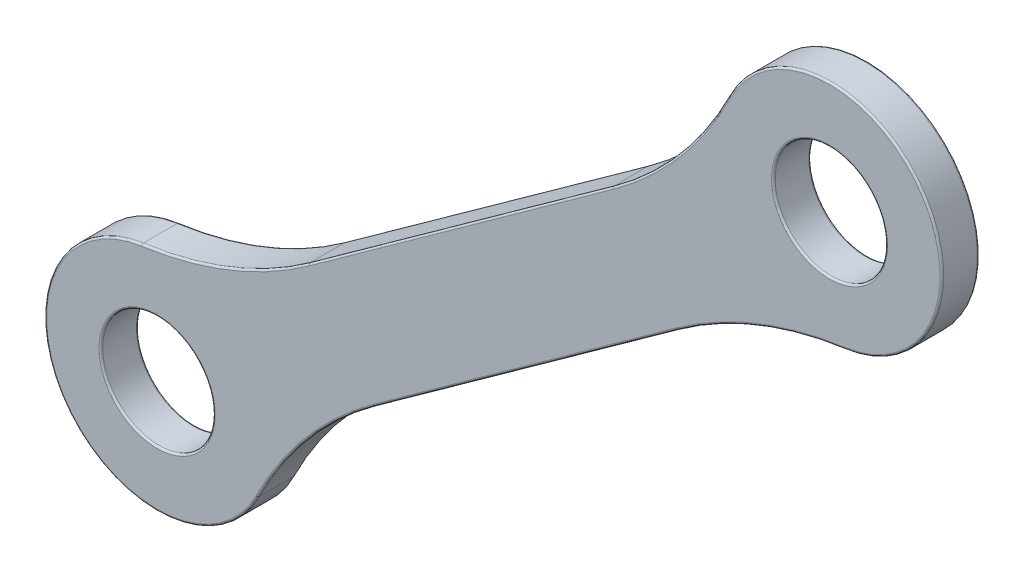
ISO-10303-21;
HEADER;
FILE_DESCRIPTION(('STEP AP214'),'2;1');
FILE_NAME('part.step','',(''),(''),'','','');
FILE_SCHEMA(('AUTOMOTIVE_DESIGN { 1 0 10303 214 1 1 1 1 }'));
ENDSEC;
DATA;
#1=APPLICATION_CONTEXT('core data for automotive mechanical design processes');
#2=APPLICATION_PROTOCOL_DEFINITION('international standard','automotive_design',2000,#1);
#3=PRODUCT_CONTEXT('',#1,'mechanical');
#4=PRODUCT('Part','Part','',(#3));
#5=PRODUCT_RELATED_PRODUCT_CATEGORY('part','',(#4));
#6=PRODUCT_DEFINITION_FORMATION('','',#4);
#7=PRODUCT_DEFINITION_CONTEXT('part definition',#1,'design');
#8=PRODUCT_DEFINITION('design','',#6,#7);
#9=PRODUCT_DEFINITION_SHAPE('','',#8);
#10=(LENGTH_UNIT() NAMED_UNIT(*) SI_UNIT(.MILLI.,.METRE.));
#11=(NAMED_UNIT(*) PLANE_ANGLE_UNIT() SI_UNIT($,.RADIAN.));
#12=(NAMED_UNIT(*) SI_UNIT($,.STERADIAN.) SOLID_ANGLE_UNIT());
#13=UNCERTAINTY_MEASURE_WITH_UNIT(LENGTH_MEASURE(1.E-05),#10,'distance_accuracy_value','');
#14=(GEOMETRIC_REPRESENTATION_CONTEXT(3) GLOBAL_UNCERTAINTY_ASSIGNED_CONTEXT((#13)) GLOBAL_UNIT_ASSIGNED_CONTEXT((#10,
#11,#12)) REPRESENTATION_CONTEXT('',''));
#15=CARTESIAN_POINT('',(0.,0.,0.));
#16=DIRECTION('',(0.,0.,1.));
#17=DIRECTION('',(1.,0.,0.));
#18=AXIS2_PLACEMENT_3D('',#15,#16,#17);
#19=CARTESIAN_POINT('',(-40.4013737131987,56.2481205256986,3.));
#20=DIRECTION('',(-0.583379304589784,0.812199844235604,0.));
#21=DIRECTION('',(-0.812199844235604,-0.583379304589784,0.));
#22=AXIS2_PLACEMENT_3D('',#19,#20,#21);
#23=PLANE('',#22);
#24=DIRECTION('',(0.,0.,-1.));
#25=VECTOR('',#24,1.);
#26=CARTESIAN_POINT('',(53.3787262530167,123.607613255152,3.));
#27=LINE('',#26,#25);
#28=CARTESIAN_POINT('',(53.3787262530167,123.607613255152,2.85));
#29=VERTEX_POINT('',#28);
#30=CARTESIAN_POINT('',(53.3787262530167,123.607613255152,0.15));
#31=VERTEX_POINT('',#30);
#32=EDGE_CURVE('E303',#29,#31,#27,.T.);
#33=ORIENTED_EDGE('',*,*,#32,.T.);
#34=DIRECTION('',(0.812199844235604,0.583379304589784,0.));
#35=VECTOR('',#34,1.);
#36=CARTESIAN_POINT('',(29.0765944172789,106.152105388458,0.15));
#37=LINE('',#36,#35);
#38=CARTESIAN_POINT('',(29.0765944172789,106.152105388458,0.15));
#39=VERTEX_POINT('',#38);
#40=EDGE_CURVE('E215',#31,#39,#37,.F.);
#41=ORIENTED_EDGE('',*,*,#40,.T.);
#42=DIRECTION('',(0.,0.,-1.));
#43=VECTOR('',#42,1.);
#44=CARTESIAN_POINT('',(29.0765944172789,106.152105388458,3.));
#45=LINE('',#44,#43);
#46=CARTESIAN_POINT('',(29.0765944172789,106.152105388458,2.85));
#47=VERTEX_POINT('',#46);
#48=EDGE_CURVE('E308',#39,#47,#45,.F.);
#49=ORIENTED_EDGE('',*,*,#48,.T.);
#50=DIRECTION('',(0.812199844235604,0.583379304589784,0.));
#51=VECTOR('',#50,1.);
#52=CARTESIAN_POINT('',(-40.4013737131987,56.2481205256986,2.85));
#53=LINE('',#52,#51);
#54=EDGE_CURVE('E213',#47,#29,#53,.T.);
#55=ORIENTED_EDGE('',*,*,#54,.T.);
#56=EDGE_LOOP('',(#33,#41,#49,#55));
#57=FACE_BOUND('',#56,.T.);
#58=ADVANCED_FACE('F35',(#57),#23,.T.);
#59=CARTESIAN_POINT('',(16.930701628719,91.8875588352438,3.));
#60=DIRECTION('',(0.,0.,-1.));
#61=DIRECTION('',(-1.,0.,0.));
#62=AXIS2_PLACEMENT_3D('',#59,#60,#61);
#63=CYLINDRICAL_SURFACE('',#62,9.00000000000006);
#64=DIRECTION('',(0.,0.,-1.));
#65=VECTOR('',#64,1.);
#66=CARTESIAN_POINT('',(15.6948201635343,100.802299269155,3.));
#67=LINE('',#66,#65);
#68=CARTESIAN_POINT('',(15.6948201635343,100.802299269155,2.85));
#69=VERTEX_POINT('',#68);
#70=CARTESIAN_POINT('',(15.6948201635343,100.802299269155,0.15));
#71=VERTEX_POINT('',#70);
#72=EDGE_CURVE('E301',#69,#71,#67,.T.);
#73=ORIENTED_EDGE('',*,*,#72,.T.);
#74=CARTESIAN_POINT('',(16.930701628719,91.8875588352438,0.15));
#75=DIRECTION('',(0.,0.,1.));
#76=DIRECTION('',(1.,0.,0.));
#77=AXIS2_PLACEMENT_3D('',#74,#75,#76);
#78=CIRCLE('',#77,9.00000000000006);
#79=CARTESIAN_POINT('',(24.9840137058486,87.8695786724804,0.15));
#80=VERTEX_POINT('',#79);
#81=EDGE_CURVE('E223',#71,#80,#78,.T.);
#82=ORIENTED_EDGE('',*,*,#81,.T.);
#83=DIRECTION('',(0.,0.,-1.));
#84=VECTOR('',#83,1.);
#85=CARTESIAN_POINT('',(24.9840137058486,87.8695786724804,3.));
#86=LINE('',#85,#84);
#87=CARTESIAN_POINT('',(24.9840137058486,87.8695786724804,2.85));
#88=VERTEX_POINT('',#87);
#89=EDGE_CURVE('E258',#80,#88,#86,.F.);
#90=ORIENTED_EDGE('',*,*,#89,.T.);
#91=CARTESIAN_POINT('',(16.930701628719,91.8875588352438,2.85));
#92=DIRECTION('',(0.,0.,1.));
#93=DIRECTION('',(1.,0.,0.));
#94=AXIS2_PLACEMENT_3D('',#91,#92,#93);
#95=CIRCLE('',#94,9.00000000000006);
#96=EDGE_CURVE('E221',#88,#69,#95,.F.);
#97=ORIENTED_EDGE('',*,*,#96,.T.);
#98=EDGE_LOOP('',(#73,#82,#90,#97));
#99=FACE_BOUND('',#98,.T.);
#100=ADVANCED_FACE('F299',(#99),#63,.T.);
#101=CARTESIAN_POINT('',(-35.1509599718906,48.9383219275781,3.));
#102=DIRECTION('',(-0.583379304589784,0.812199844235604,0.));
#103=DIRECTION('',(-0.812199844235604,-0.583379304589784,0.));
#104=AXIS2_PLACEMENT_3D('',#101,#102,#103);
#105=PLANE('',#104);
#106=DIRECTION('',(0.,0.,1.));
#107=VECTOR('',#106,1.);
#108=CARTESIAN_POINT('',(34.3270081585869,98.8423067903375,0.));
#109=LINE('',#108,#107);
#110=CARTESIAN_POINT('',(34.3270081585869,98.8423067903375,2.85));
#111=VERTEX_POINT('',#110);
#112=CARTESIAN_POINT('',(34.3270081585869,98.8423067903375,0.15));
#113=VERTEX_POINT('',#112);
#114=EDGE_CURVE('E296',#111,#113,#109,.F.);
#115=ORIENTED_EDGE('',*,*,#114,.T.);
#116=DIRECTION('',(0.812199844235604,0.583379304589784,0.));
#117=VECTOR('',#116,1.);
#118=CARTESIAN_POINT('',(-35.1509599718906,48.9383219275781,0.15));
#119=LINE('',#118,#117);
#120=CARTESIAN_POINT('',(58.6291399943248,116.297814657031,0.15));
#121=VERTEX_POINT('',#120);
#122=EDGE_CURVE('E198',#113,#121,#119,.T.);
#123=ORIENTED_EDGE('',*,*,#122,.T.);
#124=DIRECTION('',(0.,0.,1.));
#125=VECTOR('',#124,1.);
#126=CARTESIAN_POINT('',(58.6291399943248,116.297814657031,3.));
#127=LINE('',#126,#125);
#128=CARTESIAN_POINT('',(58.6291399943248,116.297814657031,2.85));
#129=VERTEX_POINT('',#128);
#130=EDGE_CURVE('E311',#121,#129,#127,.T.);
#131=ORIENTED_EDGE('',*,*,#130,.T.);
#132=DIRECTION('',(0.812199844235604,0.583379304589784,0.));
#133=VECTOR('',#132,1.);
#134=CARTESIAN_POINT('',(34.3270081585869,98.8423067903375,2.85));
#135=LINE('',#134,#133);
#136=EDGE_CURVE('E196',#129,#111,#135,.F.);
#137=ORIENTED_EDGE('',*,*,#136,.T.);
#138=EDGE_LOOP('',(#115,#123,#131,#137));
#139=FACE_BOUND('',#138,.T.);
#140=ADVANCED_FACE('F344',(#139),#105,.F.);
#141=CARTESIAN_POINT('',(70.7750327828846,130.562361210245,3.));
#142=DIRECTION('',(0.,0.,-1.));
#143=DIRECTION('',(-1.,0.,0.));
#144=AXIS2_PLACEMENT_3D('',#141,#142,#143);
#145=CYLINDRICAL_SURFACE('',#144,4.50000000000001);
#146=CARTESIAN_POINT('',(70.7750327828846,130.562361210245,0.15));
#147=DIRECTION('',(0.,0.,1.));
#148=DIRECTION('',(1.,0.,0.));
#149=AXIS2_PLACEMENT_3D('',#146,#147,#148);
#150=CIRCLE('',#149,4.50000000000001);
#151=CARTESIAN_POINT('',(75.2750327828846,130.562361210245,0.15));
#152=VERTEX_POINT('',#151);
#153=EDGE_CURVE('E190',#152,#152,#150,.F.);
#154=ORIENTED_EDGE('',*,*,#153,.T.);
#155=EDGE_LOOP('',(#154));
#156=FACE_BOUND('',#155,.T.);
#157=CARTESIAN_POINT('',(70.7750327828846,130.562361210245,2.85));
#158=DIRECTION('',(0.,0.,1.));
#159=DIRECTION('',(1.,0.,0.));
#160=AXIS2_PLACEMENT_3D('',#157,#158,#159);
#161=CIRCLE('',#160,4.50000000000001);
#162=CARTESIAN_POINT('',(75.2750327828846,130.562361210245,2.85));
#163=VERTEX_POINT('',#162);
#164=EDGE_CURVE('E187',#163,#163,#161,.T.);
#165=ORIENTED_EDGE('',*,*,#164,.T.);
#166=EDGE_LOOP('',(#165));
#167=FACE_BOUND('',#166,.T.);
#168=ADVANCED_FACE('F390',(#156,#167),#145,.F.);
#169=CARTESIAN_POINT('',(70.7750327828846,130.562361210245,3.));
#170=DIRECTION('',(0.,0.,-1.));
#171=DIRECTION('',(-1.,0.,0.));
#172=AXIS2_PLACEMENT_3D('',#169,#170,#171);
#173=CYLINDRICAL_SURFACE('',#172,9.00000000000004);
#174=DIRECTION('',(0.,0.,-1.));
#175=VECTOR('',#174,1.);
#176=CARTESIAN_POINT('',(72.0109142480693,121.647620776334,3.));
#177=LINE('',#176,#175);
#178=CARTESIAN_POINT('',(72.0109142480693,121.647620776334,2.85));
#179=VERTEX_POINT('',#178);
#180=CARTESIAN_POINT('',(72.0109142480693,121.647620776334,0.15));
#181=VERTEX_POINT('',#180);
#182=EDGE_CURVE('E318',#179,#181,#177,.T.);
#183=ORIENTED_EDGE('',*,*,#182,.T.);
#184=CARTESIAN_POINT('',(70.7750327828846,130.562361210245,0.15));
#185=DIRECTION('',(0.,0.,1.));
#186=DIRECTION('',(1.,0.,0.));
#187=AXIS2_PLACEMENT_3D('',#184,#185,#186);
#188=CIRCLE('',#187,9.00000000000004);
#189=CARTESIAN_POINT('',(62.721720705755,134.580341373009,0.15));
#190=VERTEX_POINT('',#189);
#191=EDGE_CURVE('E206',#181,#190,#188,.T.);
#192=ORIENTED_EDGE('',*,*,#191,.T.);
#193=DIRECTION('',(0.,0.,-1.));
#194=VECTOR('',#193,1.);
#195=CARTESIAN_POINT('',(62.721720705755,134.580341373009,3.));
#196=LINE('',#195,#194);
#197=CARTESIAN_POINT('',(62.721720705755,134.580341373009,2.85));
#198=VERTEX_POINT('',#197);
#199=EDGE_CURVE('E315',#190,#198,#196,.F.);
#200=ORIENTED_EDGE('',*,*,#199,.T.);
#201=CARTESIAN_POINT('',(70.7750327828846,130.562361210245,2.85));
#202=DIRECTION('',(0.,0.,1.));
#203=DIRECTION('',(1.,0.,0.));
#204=AXIS2_PLACEMENT_3D('',#201,#202,#203);
#205=CIRCLE('',#204,9.00000000000004);
#206=EDGE_CURVE('E204',#198,#179,#205,.F.);
#207=ORIENTED_EDGE('',*,*,#206,.T.);
#208=EDGE_LOOP('',(#183,#192,#200,#207));
#209=FACE_BOUND('',#208,.T.);
#210=ADVANCED_FACE('F387',(#209),#173,.T.);
#211=CARTESIAN_POINT('',(16.930701628719,91.8875588352438,3.));
#212=DIRECTION('',(0.,0.,-1.));
#213=DIRECTION('',(-1.,0.,0.));
#214=AXIS2_PLACEMENT_3D('',#211,#212,#213);
#215=CYLINDRICAL_SURFACE('',#214,4.50000000000001);
#216=CARTESIAN_POINT('',(16.930701628719,91.8875588352438,0.15));
#217=DIRECTION('',(0.,0.,1.));
#218=DIRECTION('',(1.,0.,0.));
#219=AXIS2_PLACEMENT_3D('',#216,#217,#218);
#220=CIRCLE('',#219,4.50000000000001);
#221=CARTESIAN_POINT('',(21.430701628719,91.8875588352438,0.15));
#222=VERTEX_POINT('',#221);
#223=EDGE_CURVE('E170',#222,#222,#220,.F.);
#224=ORIENTED_EDGE('',*,*,#223,.T.);
#225=EDGE_LOOP('',(#224));
#226=FACE_BOUND('',#225,.T.);
#227=CARTESIAN_POINT('',(16.930701628719,91.8875588352438,2.85));
#228=DIRECTION('',(0.,0.,1.));
#229=DIRECTION('',(1.,0.,0.));
#230=AXIS2_PLACEMENT_3D('',#227,#228,#229);
#231=CIRCLE('',#230,4.50000000000001);
#232=CARTESIAN_POINT('',(21.430701628719,91.8875588352438,2.85));
#233=VERTEX_POINT('',#232);
#234=EDGE_CURVE('E321',#233,#233,#231,.T.);
#235=ORIENTED_EDGE('',*,*,#234,.T.);
#236=EDGE_LOOP('',(#235));
#237=FACE_BOUND('',#236,.T.);
#238=ADVANCED_FACE('F389',(#226,#237),#215,.F.);
#239=CARTESIAN_POINT('',(0.,0.,3.));
#240=DIRECTION('',(0.,0.,1.));
#241=DIRECTION('',(1.,0.,0.));
#242=AXIS2_PLACEMENT_3D('',#239,#240,#241);
#243=PLANE('',#242);
#244=CARTESIAN_POINT('',(16.930701628719,91.8875588352438,3.));
#245=DIRECTION('',(0.,0.,1.));
#246=DIRECTION('',(1.,0.,0.));
#247=AXIS2_PLACEMENT_3D('',#244,#245,#246);
#248=CIRCLE('',#247,4.65000000000001);
#249=CARTESIAN_POINT('',(21.580701628719,91.8875588352438,3.));
#250=VERTEX_POINT('',#249);
#251=EDGE_CURVE('E11',#250,#250,#248,.F.);
#252=ORIENTED_EDGE('',*,*,#251,.T.);
#253=EDGE_LOOP('',(#252));
#254=FACE_BOUND('',#253,.T.);
#255=CARTESIAN_POINT('',(70.7750327828846,130.562361210245,3.));
#256=DIRECTION('',(0.,0.,1.));
#257=DIRECTION('',(1.,0.,0.));
#258=AXIS2_PLACEMENT_3D('',#255,#256,#257);
#259=CIRCLE('',#258,4.65000000000001);
#260=CARTESIAN_POINT('',(75.4250327828846,130.562361210245,3.));
#261=VERTEX_POINT('',#260);
#262=EDGE_CURVE('E44',#261,#261,#259,.F.);
#263=ORIENTED_EDGE('',*,*,#262,.T.);
#264=EDGE_LOOP('',(#263));
#265=FACE_BOUND('',#264,.T.);
#266=CARTESIAN_POINT('',(70.7750327828846,130.562361210245,3.));
#267=DIRECTION('',(0.,0.,1.));
#268=DIRECTION('',(1.,0.,0.));
#269=AXIS2_PLACEMENT_3D('',#266,#267,#268);
#270=CIRCLE('',#269,8.85000000000004);
#271=CARTESIAN_POINT('',(71.9903162236496,121.796199783566,3.));
#272=VERTEX_POINT('',#271);
#273=CARTESIAN_POINT('',(62.8559425737072,134.513375036963,3.));
#274=VERTEX_POINT('',#273);
#275=EDGE_CURVE('E52',#272,#274,#270,.T.);
#276=ORIENTED_EDGE('',*,*,#275,.T.);
#277=CARTESIAN_POINT('',(35.8773471153232,147.97360858222,3.));
#278=DIRECTION('',(0.,0.,1.));
#279=DIRECTION('',(1.,0.,0.));
#280=AXIS2_PLACEMENT_3D('',#277,#278,#279);
#281=CIRCLE('',#280,30.15);
#282=CARTESIAN_POINT('',(53.4662331487052,123.485783278516,3.));
#283=VERTEX_POINT('',#282);
#284=EDGE_CURVE('E237',#274,#283,#281,.F.);
#285=ORIENTED_EDGE('',*,*,#284,.T.);
#286=DIRECTION('',(0.812199844235604,0.583379304589784,0.));
#287=VECTOR('',#286,1.);
#288=CARTESIAN_POINT('',(-40.3138668175102,56.1262905490632,3.));
#289=LINE('',#288,#287);
#290=CARTESIAN_POINT('',(29.1641013129673,106.030275411823,3.));
#291=VERTEX_POINT('',#290);
#292=EDGE_CURVE('E225',#283,#291,#289,.F.);
#293=ORIENTED_EDGE('',*,*,#292,.T.);
#294=CARTESIAN_POINT('',(11.5752152795854,130.518100715526,3.));
#295=DIRECTION('',(0.,0.,1.));
#296=DIRECTION('',(1.,0.,0.));
#297=AXIS2_PLACEMENT_3D('',#294,#295,#296);
#298=CIRCLE('',#297,30.15);
#299=CARTESIAN_POINT('',(15.7154181879541,100.653720261923,3.));
#300=VERTEX_POINT('',#299);
#301=EDGE_CURVE('E227',#291,#300,#298,.F.);
#302=ORIENTED_EDGE('',*,*,#301,.T.);
#303=CARTESIAN_POINT('',(16.930701628719,91.8875588352438,3.));
#304=DIRECTION('',(0.,0.,1.));
#305=DIRECTION('',(1.,0.,0.));
#306=AXIS2_PLACEMENT_3D('',#303,#304,#305);
#307=CIRCLE('',#306,8.85000000000006);
#308=CARTESIAN_POINT('',(24.8497918378965,87.9365450085265,3.));
#309=VERTEX_POINT('',#308);
#310=EDGE_CURVE('E229',#300,#309,#307,.T.);
#311=ORIENTED_EDGE('',*,*,#310,.T.);
#312=CARTESIAN_POINT('',(51.8283872962804,74.4763114632694,3.));
#313=DIRECTION('',(0.,0.,1.));
#314=DIRECTION('',(1.,0.,0.));
#315=AXIS2_PLACEMENT_3D('',#312,#313,#314);
#316=CIRCLE('',#315,30.15);
#317=CARTESIAN_POINT('',(34.2395012628984,98.9641367669729,3.));
#318=VERTEX_POINT('',#317);
#319=EDGE_CURVE('E231',#309,#318,#316,.F.);
#320=ORIENTED_EDGE('',*,*,#319,.T.);
#321=DIRECTION('',(0.812199844235604,0.583379304589784,0.));
#322=VECTOR('',#321,1.);
#323=CARTESIAN_POINT('',(58.5416330986364,116.419644633667,3.));
#324=LINE('',#323,#322);
#325=CARTESIAN_POINT('',(58.5416330986364,116.419644633667,3.));
#326=VERTEX_POINT('',#325);
#327=EDGE_CURVE('E233',#318,#326,#324,.T.);
#328=ORIENTED_EDGE('',*,*,#327,.T.);
#329=CARTESIAN_POINT('',(76.1305191320183,91.9318193299631,3.));
#330=DIRECTION('',(0.,0.,1.));
#331=DIRECTION('',(1.,0.,0.));
#332=AXIS2_PLACEMENT_3D('',#329,#330,#331);
#333=CIRCLE('',#332,30.15);
#334=EDGE_CURVE('E57',#326,#272,#333,.F.);
#335=ORIENTED_EDGE('',*,*,#334,.T.);
#336=EDGE_LOOP('',(#276,#285,#293,#302,#311,#320,#328,#335));
#337=FACE_BOUND('',#336,.T.);
#338=ADVANCED_FACE('F360',(#254,#265,#337),#243,.T.);
#339=CARTESIAN_POINT('',(0.,0.,0.));
#340=DIRECTION('',(0.,0.,1.));
#341=DIRECTION('',(1.,0.,0.));
#342=AXIS2_PLACEMENT_3D('',#339,#340,#341);
#343=PLANE('',#342);
#344=CARTESIAN_POINT('',(16.930701628719,91.8875588352438,0.));
#345=DIRECTION('',(0.,0.,1.));
#346=DIRECTION('',(1.,0.,0.));
#347=AXIS2_PLACEMENT_3D('',#344,#345,#346);
#348=CIRCLE('',#347,4.65000000000001);
#349=CARTESIAN_POINT('',(21.580701628719,91.8875588352438,0.));
#350=VERTEX_POINT('',#349);
#351=EDGE_CURVE('E179',#350,#350,#348,.T.);
#352=ORIENTED_EDGE('',*,*,#351,.T.);
#353=EDGE_LOOP('',(#352));
#354=FACE_BOUND('',#353,.T.);
#355=CARTESIAN_POINT('',(70.7750327828846,130.562361210245,0.));
#356=DIRECTION('',(0.,0.,1.));
#357=DIRECTION('',(1.,0.,0.));
#358=AXIS2_PLACEMENT_3D('',#355,#356,#357);
#359=CIRCLE('',#358,4.65000000000001);
#360=CARTESIAN_POINT('',(75.4250327828846,130.562361210245,0.));
#361=VERTEX_POINT('',#360);
#362=EDGE_CURVE('E176',#361,#361,#359,.T.);
#363=ORIENTED_EDGE('',*,*,#362,.T.);
#364=EDGE_LOOP('',(#363));
#365=FACE_BOUND('',#364,.T.);
#366=DIRECTION('',(0.812199844235604,0.583379304589784,0.));
#367=VECTOR('',#366,1.);
#368=CARTESIAN_POINT('',(-35.2384668675791,49.0601519042135,0.));
#369=LINE('',#368,#367);
#370=CARTESIAN_POINT('',(58.5416330986364,116.419644633667,0.));
#371=VERTEX_POINT('',#370);
#372=CARTESIAN_POINT('',(34.2395012628984,98.9641367669729,0.));
#373=VERTEX_POINT('',#372);
#374=EDGE_CURVE('E174',#371,#373,#369,.F.);
#375=ORIENTED_EDGE('',*,*,#374,.T.);
#376=CARTESIAN_POINT('',(51.8283872962804,74.4763114632694,0.));
#377=DIRECTION('',(0.,0.,1.));
#378=DIRECTION('',(1.,0.,0.));
#379=AXIS2_PLACEMENT_3D('',#376,#377,#378);
#380=CIRCLE('',#379,30.15);
#381=CARTESIAN_POINT('',(24.8497918378965,87.9365450085265,0.));
#382=VERTEX_POINT('',#381);
#383=EDGE_CURVE('E155',#373,#382,#380,.T.);
#384=ORIENTED_EDGE('',*,*,#383,.T.);
#385=CARTESIAN_POINT('',(16.930701628719,91.8875588352438,0.));
#386=DIRECTION('',(0.,0.,1.));
#387=DIRECTION('',(1.,0.,0.));
#388=AXIS2_PLACEMENT_3D('',#385,#386,#387);
#389=CIRCLE('',#388,8.85000000000006);
#390=CARTESIAN_POINT('',(15.7154181879541,100.653720261923,0.));
#391=VERTEX_POINT('',#390);
#392=EDGE_CURVE('E163',#382,#391,#389,.F.);
#393=ORIENTED_EDGE('',*,*,#392,.T.);
#394=CARTESIAN_POINT('',(11.5752152795854,130.518100715526,0.));
#395=DIRECTION('',(0.,0.,1.));
#396=DIRECTION('',(1.,0.,0.));
#397=AXIS2_PLACEMENT_3D('',#394,#395,#396);
#398=CIRCLE('',#397,30.15);
#399=CARTESIAN_POINT('',(29.1641013129673,106.030275411823,0.));
#400=VERTEX_POINT('',#399);
#401=EDGE_CURVE('E169',#391,#400,#398,.T.);
#402=ORIENTED_EDGE('',*,*,#401,.T.);
#403=DIRECTION('',(0.812199844235604,0.583379304589784,0.));
#404=VECTOR('',#403,1.);
#405=CARTESIAN_POINT('',(53.4662331487052,123.485783278516,0.));
#406=LINE('',#405,#404);
#407=CARTESIAN_POINT('',(53.4662331487052,123.485783278516,0.));
#408=VERTEX_POINT('',#407);
#409=EDGE_CURVE('E327',#400,#408,#406,.T.);
#410=ORIENTED_EDGE('',*,*,#409,.T.);
#411=CARTESIAN_POINT('',(35.8773471153232,147.97360858222,0.));
#412=DIRECTION('',(0.,0.,1.));
#413=DIRECTION('',(1.,0.,0.));
#414=AXIS2_PLACEMENT_3D('',#411,#412,#413);
#415=CIRCLE('',#414,30.15);
#416=CARTESIAN_POINT('',(62.8559425737072,134.513375036963,0.));
#417=VERTEX_POINT('',#416);
#418=EDGE_CURVE('E329',#408,#417,#415,.T.);
#419=ORIENTED_EDGE('',*,*,#418,.T.);
#420=CARTESIAN_POINT('',(70.7750327828846,130.562361210245,0.));
#421=DIRECTION('',(0.,0.,1.));
#422=DIRECTION('',(1.,0.,0.));
#423=AXIS2_PLACEMENT_3D('',#420,#421,#422);
#424=CIRCLE('',#423,8.85000000000004);
#425=CARTESIAN_POINT('',(71.9903162236496,121.796199783566,0.));
#426=VERTEX_POINT('',#425);
#427=EDGE_CURVE('E331',#417,#426,#424,.F.);
#428=ORIENTED_EDGE('',*,*,#427,.T.);
#429=CARTESIAN_POINT('',(76.1305191320183,91.9318193299631,0.));
#430=DIRECTION('',(0.,0.,1.));
#431=DIRECTION('',(1.,0.,0.));
#432=AXIS2_PLACEMENT_3D('',#429,#430,#431);
#433=CIRCLE('',#432,30.15);
#434=EDGE_CURVE('E181',#426,#371,#433,.T.);
#435=ORIENTED_EDGE('',*,*,#434,.T.);
#436=EDGE_LOOP('',(#375,#384,#393,#402,#410,#419,#428,#435));
#437=FACE_BOUND('',#436,.T.);
#438=ADVANCED_FACE('F172',(#354,#365,#437),#343,.F.);
#439=CARTESIAN_POINT('',(11.5752152795854,130.518100715526,3.));
#440=DIRECTION('',(0.,0.,-1.));
#441=DIRECTION('',(-1.,0.,0.));
#442=AXIS2_PLACEMENT_3D('',#439,#440,#441);
#443=CYLINDRICAL_SURFACE('',#442,30.);
#444=ORIENTED_EDGE('',*,*,#48,.F.);
#445=CARTESIAN_POINT('',(11.5752152795854,130.518100715526,0.15));
#446=DIRECTION('',(0.,0.,1.));
#447=DIRECTION('',(1.,0.,0.));
#448=AXIS2_PLACEMENT_3D('',#445,#446,#447);
#449=CIRCLE('',#448,30.);
#450=EDGE_CURVE('E219',#39,#71,#449,.F.);
#451=ORIENTED_EDGE('',*,*,#450,.T.);
#452=ORIENTED_EDGE('',*,*,#72,.F.);
#453=CARTESIAN_POINT('',(11.5752152795854,130.518100715526,2.85));
#454=DIRECTION('',(0.,0.,1.));
#455=DIRECTION('',(1.,0.,0.));
#456=AXIS2_PLACEMENT_3D('',#453,#454,#455);
#457=CIRCLE('',#456,30.);
#458=EDGE_CURVE('E217',#69,#47,#457,.T.);
#459=ORIENTED_EDGE('',*,*,#458,.T.);
#460=EDGE_LOOP('',(#444,#451,#452,#459));
#461=FACE_BOUND('',#460,.T.);
#462=ADVANCED_FACE('F408',(#461),#443,.F.);
#463=CARTESIAN_POINT('',(51.8283872962804,74.4763114632694,3.));
#464=DIRECTION('',(0.,0.,-1.));
#465=DIRECTION('',(-1.,0.,0.));
#466=AXIS2_PLACEMENT_3D('',#463,#464,#465);
#467=CYLINDRICAL_SURFACE('',#466,30.);
#468=ORIENTED_EDGE('',*,*,#89,.F.);
#469=CARTESIAN_POINT('',(51.8283872962804,74.4763114632694,0.15));
#470=DIRECTION('',(0.,0.,1.));
#471=DIRECTION('',(1.,0.,0.));
#472=AXIS2_PLACEMENT_3D('',#469,#470,#471);
#473=CIRCLE('',#472,30.);
#474=EDGE_CURVE('E157',#80,#113,#473,.F.);
#475=ORIENTED_EDGE('',*,*,#474,.T.);
#476=ORIENTED_EDGE('',*,*,#114,.F.);
#477=CARTESIAN_POINT('',(51.8283872962804,74.4763114632694,2.85));
#478=DIRECTION('',(0.,0.,1.));
#479=DIRECTION('',(1.,0.,0.));
#480=AXIS2_PLACEMENT_3D('',#477,#478,#479);
#481=CIRCLE('',#480,30.);
#482=EDGE_CURVE('E193',#111,#88,#481,.T.);
#483=ORIENTED_EDGE('',*,*,#482,.T.);
#484=EDGE_LOOP('',(#468,#475,#476,#483));
#485=FACE_BOUND('',#484,.T.);
#486=ADVANCED_FACE('F294',(#485),#467,.F.);
#487=CARTESIAN_POINT('',(76.1305191320183,91.9318193299631,3.));
#488=DIRECTION('',(0.,0.,-1.));
#489=DIRECTION('',(-1.,0.,0.));
#490=AXIS2_PLACEMENT_3D('',#487,#488,#489);
#491=CYLINDRICAL_SURFACE('',#490,30.);
#492=ORIENTED_EDGE('',*,*,#130,.F.);
#493=CARTESIAN_POINT('',(76.1305191320183,91.9318193299631,0.15));
#494=DIRECTION('',(0.,0.,1.));
#495=DIRECTION('',(1.,0.,0.));
#496=AXIS2_PLACEMENT_3D('',#493,#494,#495);
#497=CIRCLE('',#496,30.);
#498=EDGE_CURVE('E202',#121,#181,#497,.F.);
#499=ORIENTED_EDGE('',*,*,#498,.T.);
#500=ORIENTED_EDGE('',*,*,#182,.F.);
#501=CARTESIAN_POINT('',(76.1305191320183,91.9318193299631,2.85));
#502=DIRECTION('',(0.,0.,1.));
#503=DIRECTION('',(1.,0.,0.));
#504=AXIS2_PLACEMENT_3D('',#501,#502,#503);
#505=CIRCLE('',#504,30.);
#506=EDGE_CURVE('E200',#179,#129,#505,.T.);
#507=ORIENTED_EDGE('',*,*,#506,.T.);
#508=EDGE_LOOP('',(#492,#499,#500,#507));
#509=FACE_BOUND('',#508,.T.);
#510=ADVANCED_FACE('F346',(#509),#491,.F.);
#511=CARTESIAN_POINT('',(35.8773471153232,147.97360858222,3.));
#512=DIRECTION('',(0.,0.,-1.));
#513=DIRECTION('',(-1.,0.,0.));
#514=AXIS2_PLACEMENT_3D('',#511,#512,#513);
#515=CYLINDRICAL_SURFACE('',#514,30.);
#516=ORIENTED_EDGE('',*,*,#199,.F.);
#517=CARTESIAN_POINT('',(35.8773471153232,147.97360858222,0.15));
#518=DIRECTION('',(0.,0.,1.));
#519=DIRECTION('',(1.,0.,0.));
#520=AXIS2_PLACEMENT_3D('',#517,#518,#519);
#521=CIRCLE('',#520,30.);
#522=EDGE_CURVE('E211',#190,#31,#521,.F.);
#523=ORIENTED_EDGE('',*,*,#522,.T.);
#524=ORIENTED_EDGE('',*,*,#32,.F.);
#525=CARTESIAN_POINT('',(35.8773471153232,147.97360858222,2.85));
#526=DIRECTION('',(0.,0.,1.));
#527=DIRECTION('',(1.,0.,0.));
#528=AXIS2_PLACEMENT_3D('',#525,#526,#527);
#529=CIRCLE('',#528,30.);
#530=EDGE_CURVE('E208',#29,#198,#529,.T.);
#531=ORIENTED_EDGE('',*,*,#530,.T.);
#532=EDGE_LOOP('',(#516,#523,#524,#531));
#533=FACE_BOUND('',#532,.T.);
#534=ADVANCED_FACE('F376',(#533),#515,.F.);
#535=CARTESIAN_POINT('',(16.930701628719,91.8875588352438,0.15));
#536=DIRECTION('',(0.,0.,1.));
#537=DIRECTION('',(1.,0.,0.));
#538=AXIS2_PLACEMENT_3D('',#535,#536,#537);
#539=TOROIDAL_SURFACE('',#538,4.65000000000001,0.15);
#540=ORIENTED_EDGE('',*,*,#351,.F.);
#541=EDGE_LOOP('',(#540));
#542=FACE_BOUND('',#541,.T.);
#543=ORIENTED_EDGE('',*,*,#223,.F.);
#544=EDGE_LOOP('',(#543));
#545=FACE_BOUND('',#544,.T.);
#546=ADVANCED_FACE('F418',(#542,#545),#539,.T.);
#547=CARTESIAN_POINT('',(70.7750327828846,130.562361210245,0.15));
#548=DIRECTION('',(0.,0.,1.));
#549=DIRECTION('',(1.,0.,0.));
#550=AXIS2_PLACEMENT_3D('',#547,#548,#549);
#551=TOROIDAL_SURFACE('',#550,4.65000000000001,0.15);
#552=ORIENTED_EDGE('',*,*,#153,.F.);
#553=EDGE_LOOP('',(#552));
#554=FACE_BOUND('',#553,.T.);
#555=ORIENTED_EDGE('',*,*,#362,.F.);
#556=EDGE_LOOP('',(#555));
#557=FACE_BOUND('',#556,.T.);
#558=ADVANCED_FACE('F421',(#554,#557),#551,.T.);
#559=CARTESIAN_POINT('',(35.8773471153232,147.97360858222,0.15));
#560=DIRECTION('',(0.,0.,1.));
#561=DIRECTION('',(1.,0.,0.));
#562=AXIS2_PLACEMENT_3D('',#559,#560,#561);
#563=TOROIDAL_SURFACE('',#562,30.15,0.15);
#564=CARTESIAN_POINT('',(53.4662331487052,123.485783278516,0.15));
#565=DIRECTION('',(-0.812199844235612,-0.583379304589773,0.));
#566=DIRECTION('',(0.583379304589773,-0.812199844235612,0.));
#567=AXIS2_PLACEMENT_3D('',#564,#565,#566);
#568=CIRCLE('',#567,0.15);
#569=EDGE_CURVE('E252',#31,#408,#568,.T.);
#570=ORIENTED_EDGE('',*,*,#569,.F.);
#571=ORIENTED_EDGE('',*,*,#522,.F.);
#572=CARTESIAN_POINT('',(62.8559425737072,134.513375036963,0.15));
#573=DIRECTION('',(0.446442240306991,0.894812453014415,0.));
#574=DIRECTION('',(-0.894812453014415,0.446442240306991,0.));
#575=AXIS2_PLACEMENT_3D('',#572,#573,#574);
#576=CIRCLE('',#575,0.15);
#577=EDGE_CURVE('E255',#417,#190,#576,.T.);
#578=ORIENTED_EDGE('',*,*,#577,.F.);
#579=ORIENTED_EDGE('',*,*,#418,.F.);
#580=EDGE_LOOP('',(#570,#571,#578,#579));
#581=FACE_BOUND('',#580,.T.);
#582=ADVANCED_FACE('F380',(#581),#563,.T.);
#583=CARTESIAN_POINT('',(70.7750327828846,130.562361210245,0.15));
#584=DIRECTION('',(0.,0.,1.));
#585=DIRECTION('',(1.,0.,0.));
#586=AXIS2_PLACEMENT_3D('',#583,#584,#585);
#587=TOROIDAL_SURFACE('',#586,8.85000000000004,0.15);
#588=ORIENTED_EDGE('',*,*,#577,.T.);
#589=ORIENTED_EDGE('',*,*,#191,.F.);
#590=CARTESIAN_POINT('',(71.9903162236496,121.796199783566,0.15));
#591=DIRECTION('',(-0.990526714879036,-0.137320162798276,0.));
#592=DIRECTION('',(0.137320162798276,-0.990526714879036,0.));
#593=AXIS2_PLACEMENT_3D('',#590,#591,#592);
#594=CIRCLE('',#593,0.15);
#595=EDGE_CURVE('E249',#426,#181,#594,.T.);
#596=ORIENTED_EDGE('',*,*,#595,.F.);
#597=ORIENTED_EDGE('',*,*,#427,.F.);
#598=EDGE_LOOP('',(#588,#589,#596,#597));
#599=FACE_BOUND('',#598,.T.);
#600=ADVANCED_FACE('F385',(#599),#587,.T.);
#601=CARTESIAN_POINT('',(-40.3138668175102,56.1262905490632,0.15));
#602=DIRECTION('',(-0.812199844235604,-0.583379304589784,0.));
#603=DIRECTION('',(0.583379304589784,-0.812199844235604,0.));
#604=AXIS2_PLACEMENT_3D('',#601,#602,#603);
#605=CYLINDRICAL_SURFACE('',#604,0.15);
#606=ORIENTED_EDGE('',*,*,#569,.T.);
#607=ORIENTED_EDGE('',*,*,#409,.F.);
#608=CARTESIAN_POINT('',(29.1641013129673,106.030275411823,0.15));
#609=DIRECTION('',(-0.812199844235612,-0.583379304589773,0.));
#610=DIRECTION('',(0.583379304589773,-0.812199844235612,0.));
#611=AXIS2_PLACEMENT_3D('',#608,#609,#610);
#612=CIRCLE('',#611,0.15);
#613=EDGE_CURVE('E246',#39,#400,#612,.T.);
#614=ORIENTED_EDGE('',*,*,#613,.F.);
#615=ORIENTED_EDGE('',*,*,#40,.F.);
#616=EDGE_LOOP('',(#606,#607,#614,#615));
#617=FACE_BOUND('',#616,.T.);
#618=ADVANCED_FACE('F439',(#617),#605,.T.);
#619=CARTESIAN_POINT('',(76.1305191320183,91.9318193299631,0.15));
#620=DIRECTION('',(0.,0.,1.));
#621=DIRECTION('',(1.,0.,0.));
#622=AXIS2_PLACEMENT_3D('',#619,#620,#621);
#623=TOROIDAL_SURFACE('',#622,30.15,0.15);
#624=ORIENTED_EDGE('',*,*,#595,.T.);
#625=ORIENTED_EDGE('',*,*,#498,.F.);
#626=CARTESIAN_POINT('',(58.5416330986364,116.419644633667,0.15));
#627=DIRECTION('',(-0.812199844235581,-0.583379304589817,0.));
#628=DIRECTION('',(0.583379304589817,-0.812199844235581,0.));
#629=AXIS2_PLACEMENT_3D('',#626,#627,#628);
#630=CIRCLE('',#629,0.15);
#631=EDGE_CURVE('E243',#371,#121,#630,.T.);
#632=ORIENTED_EDGE('',*,*,#631,.F.);
#633=ORIENTED_EDGE('',*,*,#434,.F.);
#634=EDGE_LOOP('',(#624,#625,#632,#633));
#635=FACE_BOUND('',#634,.T.);
#636=ADVANCED_FACE('F338',(#635),#623,.T.);
#637=CARTESIAN_POINT('',(11.5752152795854,130.518100715526,0.15));
#638=DIRECTION('',(0.,0.,1.));
#639=DIRECTION('',(1.,0.,0.));
#640=AXIS2_PLACEMENT_3D('',#637,#638,#639);
#641=TOROIDAL_SURFACE('',#640,30.15,0.15);
#642=ORIENTED_EDGE('',*,*,#613,.T.);
#643=ORIENTED_EDGE('',*,*,#401,.F.);
#644=CARTESIAN_POINT('',(15.7154181879541,100.653720261923,0.15));
#645=DIRECTION('',(-0.990526714879033,-0.137320162798299,0.));
#646=DIRECTION('',(0.137320162798299,-0.990526714879033,0.));
#647=AXIS2_PLACEMENT_3D('',#644,#645,#646);
#648=CIRCLE('',#647,0.15);
#649=EDGE_CURVE('E166',#71,#391,#648,.T.);
#650=ORIENTED_EDGE('',*,*,#649,.F.);
#651=ORIENTED_EDGE('',*,*,#450,.F.);
#652=EDGE_LOOP('',(#642,#643,#650,#651));
#653=FACE_BOUND('',#652,.T.);
#654=ADVANCED_FACE('F433',(#653),#641,.T.);
#655=CARTESIAN_POINT('',(-35.2384668675791,49.0601519042135,0.15));
#656=DIRECTION('',(0.812199844235604,0.583379304589784,0.));
#657=DIRECTION('',(-0.583379304589784,0.812199844235604,0.));
#658=AXIS2_PLACEMENT_3D('',#655,#656,#657);
#659=CYLINDRICAL_SURFACE('',#658,0.15);
#660=ORIENTED_EDGE('',*,*,#631,.T.);
#661=ORIENTED_EDGE('',*,*,#122,.F.);
#662=CARTESIAN_POINT('',(34.2395012628984,98.9641367669729,0.15));
#663=DIRECTION('',(-0.812199844235581,-0.583379304589817,0.));
#664=DIRECTION('',(0.583379304589817,-0.812199844235581,0.));
#665=AXIS2_PLACEMENT_3D('',#662,#663,#664);
#666=CIRCLE('',#665,0.15);
#667=EDGE_CURVE('E160',#373,#113,#666,.T.);
#668=ORIENTED_EDGE('',*,*,#667,.F.);
#669=ORIENTED_EDGE('',*,*,#374,.F.);
#670=EDGE_LOOP('',(#660,#661,#668,#669));
#671=FACE_BOUND('',#670,.T.);
#672=ADVANCED_FACE('F341',(#671),#659,.T.);
#673=CARTESIAN_POINT('',(16.930701628719,91.8875588352438,0.15));
#674=DIRECTION('',(0.,0.,1.));
#675=DIRECTION('',(1.,0.,0.));
#676=AXIS2_PLACEMENT_3D('',#673,#674,#675);
#677=TOROIDAL_SURFACE('',#676,8.85000000000006,0.15);
#678=ORIENTED_EDGE('',*,*,#649,.T.);
#679=ORIENTED_EDGE('',*,*,#392,.F.);
#680=CARTESIAN_POINT('',(24.8497918378965,87.9365450085265,0.15));
#681=DIRECTION('',(0.446442240307028,0.894812453014396,0.));
#682=DIRECTION('',(-0.894812453014396,0.446442240307028,0.));
#683=AXIS2_PLACEMENT_3D('',#680,#681,#682);
#684=CIRCLE('',#683,0.15);
#685=EDGE_CURVE('E151',#80,#382,#684,.T.);
#686=ORIENTED_EDGE('',*,*,#685,.F.);
#687=ORIENTED_EDGE('',*,*,#81,.F.);
#688=EDGE_LOOP('',(#678,#679,#686,#687));
#689=FACE_BOUND('',#688,.T.);
#690=ADVANCED_FACE('F164',(#689),#677,.T.);
#691=CARTESIAN_POINT('',(51.8283872962804,74.4763114632694,0.15));
#692=DIRECTION('',(0.,0.,1.));
#693=DIRECTION('',(1.,0.,0.));
#694=AXIS2_PLACEMENT_3D('',#691,#692,#693);
#695=TOROIDAL_SURFACE('',#694,30.15,0.15);
#696=ORIENTED_EDGE('',*,*,#667,.T.);
#697=ORIENTED_EDGE('',*,*,#474,.F.);
#698=ORIENTED_EDGE('',*,*,#685,.T.);
#699=ORIENTED_EDGE('',*,*,#383,.F.);
#700=EDGE_LOOP('',(#696,#697,#698,#699));
#701=FACE_BOUND('',#700,.T.);
#702=ADVANCED_FACE('F153',(#701),#695,.T.);
#703=CARTESIAN_POINT('',(16.930701628719,91.8875588352438,2.85));
#704=DIRECTION('',(0.,0.,1.));
#705=DIRECTION('',(1.,0.,0.));
#706=AXIS2_PLACEMENT_3D('',#703,#704,#705);
#707=TOROIDAL_SURFACE('',#706,4.65000000000001,0.15);
#708=ORIENTED_EDGE('',*,*,#234,.F.);
#709=EDGE_LOOP('',(#708));
#710=FACE_BOUND('',#709,.T.);
#711=ORIENTED_EDGE('',*,*,#251,.F.);
#712=EDGE_LOOP('',(#711));
#713=FACE_BOUND('',#712,.T.);
#714=ADVANCED_FACE('F428',(#710,#713),#707,.T.);
#715=CARTESIAN_POINT('',(70.7750327828846,130.562361210245,2.85));
#716=DIRECTION('',(0.,0.,1.));
#717=DIRECTION('',(1.,0.,0.));
#718=AXIS2_PLACEMENT_3D('',#715,#716,#717);
#719=TOROIDAL_SURFACE('',#718,4.65000000000001,0.15);
#720=ORIENTED_EDGE('',*,*,#262,.F.);
#721=EDGE_LOOP('',(#720));
#722=FACE_BOUND('',#721,.T.);
#723=ORIENTED_EDGE('',*,*,#164,.F.);
#724=EDGE_LOOP('',(#723));
#725=FACE_BOUND('',#724,.T.);
#726=ADVANCED_FACE('F449',(#722,#725),#719,.T.);
#727=CARTESIAN_POINT('',(51.8283872962804,74.4763114632694,2.85));
#728=DIRECTION('',(0.,0.,1.));
#729=DIRECTION('',(1.,0.,0.));
#730=AXIS2_PLACEMENT_3D('',#727,#728,#729);
#731=TOROIDAL_SURFACE('',#730,30.15,0.15);
#732=CARTESIAN_POINT('',(24.8497918378965,87.9365450085265,2.85));
#733=DIRECTION('',(-0.446442240307028,-0.894812453014396,0.));
#734=DIRECTION('',(0.894812453014396,-0.446442240307028,0.));
#735=AXIS2_PLACEMENT_3D('',#732,#733,#734);
#736=CIRCLE('',#735,0.15);
#737=EDGE_CURVE('E274',#88,#309,#736,.T.);
#738=ORIENTED_EDGE('',*,*,#737,.F.);
#739=ORIENTED_EDGE('',*,*,#482,.F.);
#740=CARTESIAN_POINT('',(34.2395012628984,98.9641367669729,2.85));
#741=DIRECTION('',(0.812199844235581,0.583379304589817,0.));
#742=DIRECTION('',(-0.583379304589817,0.812199844235581,0.));
#743=AXIS2_PLACEMENT_3D('',#740,#741,#742);
#744=CIRCLE('',#743,0.15);
#745=EDGE_CURVE('E39',#318,#111,#744,.T.);
#746=ORIENTED_EDGE('',*,*,#745,.F.);
#747=ORIENTED_EDGE('',*,*,#319,.F.);
#748=EDGE_LOOP('',(#738,#739,#746,#747));
#749=FACE_BOUND('',#748,.T.);
#750=ADVANCED_FACE('F37',(#749),#731,.T.);
#751=CARTESIAN_POINT('',(-35.2384668675791,49.0601519042135,2.85));
#752=DIRECTION('',(-0.812199844235604,-0.583379304589784,0.));
#753=DIRECTION('',(0.583379304589784,-0.812199844235604,0.));
#754=AXIS2_PLACEMENT_3D('',#751,#752,#753);
#755=CYLINDRICAL_SURFACE('',#754,0.15);
#756=ORIENTED_EDGE('',*,*,#745,.T.);
#757=ORIENTED_EDGE('',*,*,#136,.F.);
#758=CARTESIAN_POINT('',(58.5416330986364,116.419644633667,2.85));
#759=DIRECTION('',(0.81219984423559,0.583379304589804,0.));
#760=DIRECTION('',(-0.583379304589804,0.81219984423559,0.));
#761=AXIS2_PLACEMENT_3D('',#758,#759,#760);
#762=CIRCLE('',#761,0.15);
#763=EDGE_CURVE('E272',#326,#129,#762,.T.);
#764=ORIENTED_EDGE('',*,*,#763,.F.);
#765=ORIENTED_EDGE('',*,*,#327,.F.);
#766=EDGE_LOOP('',(#756,#757,#764,#765));
#767=FACE_BOUND('',#766,.T.);
#768=ADVANCED_FACE('F285',(#767),#755,.T.);
#769=CARTESIAN_POINT('',(16.930701628719,91.8875588352438,2.85));
#770=DIRECTION('',(0.,0.,1.));
#771=DIRECTION('',(1.,0.,0.));
#772=AXIS2_PLACEMENT_3D('',#769,#770,#771);
#773=TOROIDAL_SURFACE('',#772,8.85000000000006,0.15);
#774=ORIENTED_EDGE('',*,*,#737,.T.);
#775=ORIENTED_EDGE('',*,*,#310,.F.);
#776=CARTESIAN_POINT('',(15.7154181879541,100.653720261923,2.85));
#777=DIRECTION('',(0.990526714879033,0.137320162798299,0.));
#778=DIRECTION('',(-0.137320162798299,0.990526714879033,0.));
#779=AXIS2_PLACEMENT_3D('',#776,#777,#778);
#780=CIRCLE('',#779,0.15);
#781=EDGE_CURVE('E269',#69,#300,#780,.T.);
#782=ORIENTED_EDGE('',*,*,#781,.F.);
#783=ORIENTED_EDGE('',*,*,#96,.F.);
#784=EDGE_LOOP('',(#774,#775,#782,#783));
#785=FACE_BOUND('',#784,.T.);
#786=ADVANCED_FACE('F464',(#785),#773,.T.);
#787=CARTESIAN_POINT('',(76.1305191320183,91.9318193299631,2.85));
#788=DIRECTION('',(0.,0.,1.));
#789=DIRECTION('',(1.,0.,0.));
#790=AXIS2_PLACEMENT_3D('',#787,#788,#789);
#791=TOROIDAL_SURFACE('',#790,30.15,0.15);
#792=ORIENTED_EDGE('',*,*,#763,.T.);
#793=ORIENTED_EDGE('',*,*,#506,.F.);
#794=CARTESIAN_POINT('',(71.9903162236496,121.796199783566,2.85));
#795=DIRECTION('',(0.990526714879038,0.137320162798264,0.));
#796=DIRECTION('',(-0.137320162798264,0.990526714879038,0.));
#797=AXIS2_PLACEMENT_3D('',#794,#795,#796);
#798=CIRCLE('',#797,0.15);
#799=EDGE_CURVE('E266',#272,#179,#798,.T.);
#800=ORIENTED_EDGE('',*,*,#799,.F.);
#801=ORIENTED_EDGE('',*,*,#334,.F.);
#802=EDGE_LOOP('',(#792,#793,#800,#801));
#803=FACE_BOUND('',#802,.T.);
#804=ADVANCED_FACE('F350',(#803),#791,.T.);
#805=CARTESIAN_POINT('',(11.5752152795854,130.518100715526,2.85));
#806=DIRECTION('',(0.,0.,1.));
#807=DIRECTION('',(1.,0.,0.));
#808=AXIS2_PLACEMENT_3D('',#805,#806,#807);
#809=TOROIDAL_SURFACE('',#808,30.15,0.15);
#810=ORIENTED_EDGE('',*,*,#781,.T.);
#811=ORIENTED_EDGE('',*,*,#301,.F.);
#812=CARTESIAN_POINT('',(29.1641013129673,106.030275411823,2.85));
#813=DIRECTION('',(0.812199844235612,0.583379304589773,0.));
#814=DIRECTION('',(-0.583379304589773,0.812199844235612,0.));
#815=AXIS2_PLACEMENT_3D('',#812,#813,#814);
#816=CIRCLE('',#815,0.15);
#817=EDGE_CURVE('E263',#47,#291,#816,.T.);
#818=ORIENTED_EDGE('',*,*,#817,.F.);
#819=ORIENTED_EDGE('',*,*,#458,.F.);
#820=EDGE_LOOP('',(#810,#811,#818,#819));
#821=FACE_BOUND('',#820,.T.);
#822=ADVANCED_FACE('F365',(#821),#809,.T.);
#823=CARTESIAN_POINT('',(70.7750327828846,130.562361210245,2.85));
#824=DIRECTION('',(0.,0.,1.));
#825=DIRECTION('',(1.,0.,0.));
#826=AXIS2_PLACEMENT_3D('',#823,#824,#825);
#827=TOROIDAL_SURFACE('',#826,8.85000000000004,0.15);
#828=ORIENTED_EDGE('',*,*,#799,.T.);
#829=ORIENTED_EDGE('',*,*,#206,.F.);
#830=CARTESIAN_POINT('',(62.8559425737072,134.513375036963,2.85));
#831=DIRECTION('',(-0.446442240307028,-0.894812453014396,0.));
#832=DIRECTION('',(0.894812453014396,-0.446442240307028,0.));
#833=AXIS2_PLACEMENT_3D('',#830,#831,#832);
#834=CIRCLE('',#833,0.15);
#835=EDGE_CURVE('E261',#274,#198,#834,.T.);
#836=ORIENTED_EDGE('',*,*,#835,.F.);
#837=ORIENTED_EDGE('',*,*,#275,.F.);
#838=EDGE_LOOP('',(#828,#829,#836,#837));
#839=FACE_BOUND('',#838,.T.);
#840=ADVANCED_FACE('F353',(#839),#827,.T.);
#841=CARTESIAN_POINT('',(-40.3138668175102,56.1262905490632,2.85));
#842=DIRECTION('',(0.812199844235604,0.583379304589784,0.));
#843=DIRECTION('',(-0.583379304589784,0.812199844235604,0.));
#844=AXIS2_PLACEMENT_3D('',#841,#842,#843);
#845=CYLINDRICAL_SURFACE('',#844,0.15);
#846=ORIENTED_EDGE('',*,*,#817,.T.);
#847=ORIENTED_EDGE('',*,*,#292,.F.);
#848=CARTESIAN_POINT('',(53.4662331487052,123.485783278516,2.85));
#849=DIRECTION('',(0.812199844235612,0.583379304589773,0.));
#850=DIRECTION('',(-0.583379304589773,0.812199844235612,0.));
#851=AXIS2_PLACEMENT_3D('',#848,#849,#850);
#852=CIRCLE('',#851,0.15);
#853=EDGE_CURVE('E259',#29,#283,#852,.T.);
#854=ORIENTED_EDGE('',*,*,#853,.F.);
#855=ORIENTED_EDGE('',*,*,#54,.F.);
#856=EDGE_LOOP('',(#846,#847,#854,#855));
#857=FACE_BOUND('',#856,.T.);
#858=ADVANCED_FACE('F369',(#857),#845,.T.);
#859=CARTESIAN_POINT('',(35.8773471153232,147.97360858222,2.85));
#860=DIRECTION('',(0.,0.,1.));
#861=DIRECTION('',(1.,0.,0.));
#862=AXIS2_PLACEMENT_3D('',#859,#860,#861);
#863=TOROIDAL_SURFACE('',#862,30.15,0.15);
#864=ORIENTED_EDGE('',*,*,#835,.T.);
#865=ORIENTED_EDGE('',*,*,#530,.F.);
#866=ORIENTED_EDGE('',*,*,#853,.T.);
#867=ORIENTED_EDGE('',*,*,#284,.F.);
#868=EDGE_LOOP('',(#864,#865,#866,#867));
#869=FACE_BOUND('',#868,.T.);
#870=ADVANCED_FACE('F357',(#869),#863,.T.);
#871=CLOSED_SHELL('',(#58,#100,#140,#168,#210,#238,#338,#438,#462,#486,#510,#534,#546,#558,#582,
#600,#618,#636,#654,#672,#690,#702,#714,#726,#750,#768,#786,#804,#822,#840,#858,#870));
#872=MANIFOLD_SOLID_BREP('B2',#871);
#873=ADVANCED_BREP_SHAPE_REPRESENTATION('',(#18,#872),#14);
#874=SHAPE_DEFINITION_REPRESENTATION(#9,#873);
ENDSEC;
END-ISO-10303-21;
